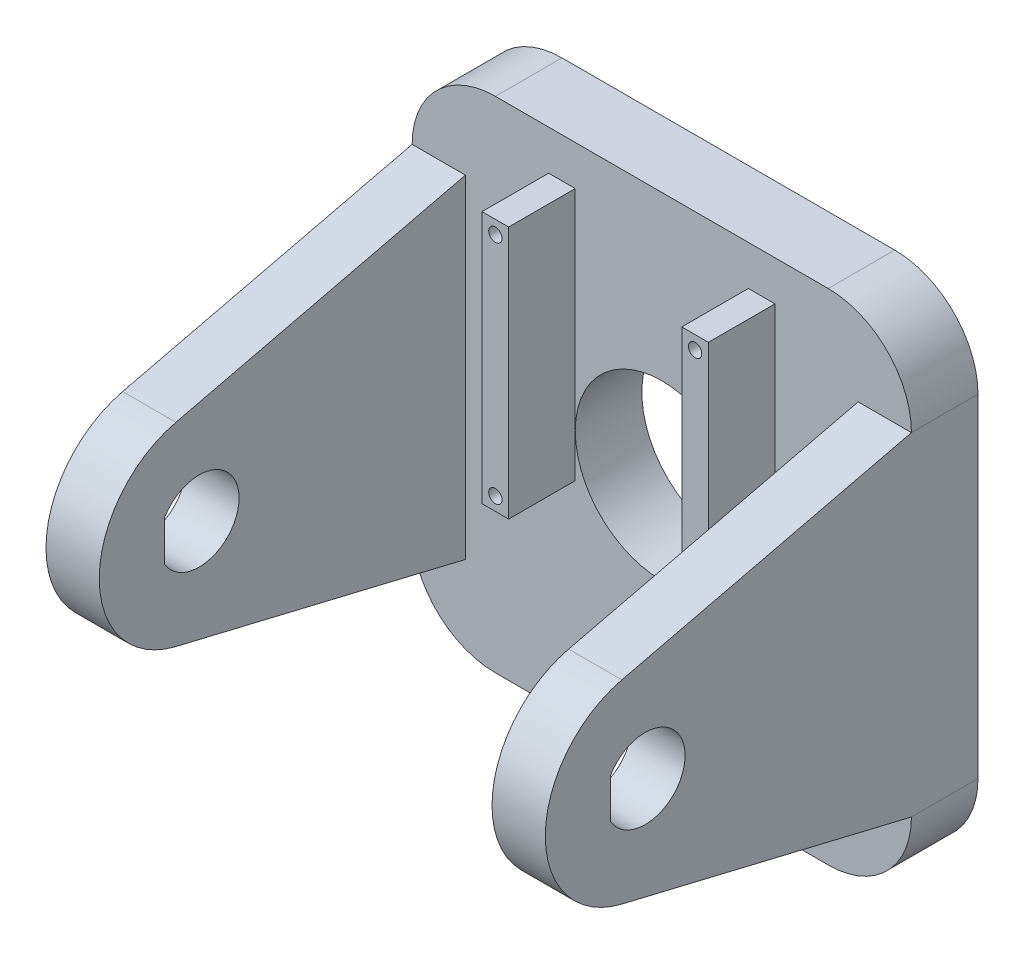
ISO-10303-21;
HEADER;
FILE_DESCRIPTION(('STEP AP214'),'2;1');
FILE_NAME('part.step','',(''),(''),'','','');
FILE_SCHEMA(('AUTOMOTIVE_DESIGN { 1 0 10303 214 1 1 1 1 }'));
ENDSEC;
DATA;
#1=APPLICATION_CONTEXT('core data for automotive mechanical design processes');
#2=APPLICATION_PROTOCOL_DEFINITION('international standard','automotive_design',2000,#1);
#3=PRODUCT_CONTEXT('',#1,'mechanical');
#4=PRODUCT('Part','Part','',(#3));
#5=PRODUCT_RELATED_PRODUCT_CATEGORY('part','',(#4));
#6=PRODUCT_DEFINITION_FORMATION('','',#4);
#7=PRODUCT_DEFINITION_CONTEXT('part definition',#1,'design');
#8=PRODUCT_DEFINITION('design','',#6,#7);
#9=PRODUCT_DEFINITION_SHAPE('','',#8);
#10=(LENGTH_UNIT() NAMED_UNIT(*) SI_UNIT(.MILLI.,.METRE.));
#11=(NAMED_UNIT(*) PLANE_ANGLE_UNIT() SI_UNIT($,.RADIAN.));
#12=(NAMED_UNIT(*) SI_UNIT($,.STERADIAN.) SOLID_ANGLE_UNIT());
#13=UNCERTAINTY_MEASURE_WITH_UNIT(LENGTH_MEASURE(1.E-05),#10,'distance_accuracy_value','');
#14=(GEOMETRIC_REPRESENTATION_CONTEXT(3) GLOBAL_UNCERTAINTY_ASSIGNED_CONTEXT((#13)) GLOBAL_UNIT_ASSIGNED_CONTEXT((#10,
#11,#12)) REPRESENTATION_CONTEXT('',''));
#15=CARTESIAN_POINT('',(0.,0.,0.));
#16=DIRECTION('',(0.,0.,1.));
#17=DIRECTION('',(1.,0.,0.));
#18=AXIS2_PLACEMENT_3D('',#15,#16,#17);
#19=CARTESIAN_POINT('',(25.,-25.,10.));
#20=DIRECTION('',(0.,0.,-1.));
#21=DIRECTION('',(-1.,0.,0.));
#22=AXIS2_PLACEMENT_3D('',#19,#20,#21);
#23=PLANE('',#22);
#24=DIRECTION('',(-1.,0.,0.));
#25=VECTOR('',#24,1.);
#26=CARTESIAN_POINT('',(-29.5,24.9999999999999,10.));
#27=LINE('',#26,#25);
#28=CARTESIAN_POINT('',(-29.5,24.9999999999999,10.));
#29=VERTEX_POINT('',#28);
#30=CARTESIAN_POINT('',(-37.5,24.9999999999999,10.));
#31=VERTEX_POINT('',#30);
#32=EDGE_CURVE('E356',#29,#31,#27,.T.);
#33=ORIENTED_EDGE('',*,*,#32,.F.);
#34=DIRECTION('',(0.,-1.,0.));
#35=VECTOR('',#34,1.);
#36=CARTESIAN_POINT('',(-29.5,0.,10.));
#37=LINE('',#36,#35);
#38=CARTESIAN_POINT('',(-29.5,-24.9999999999999,10.));
#39=VERTEX_POINT('',#38);
#40=EDGE_CURVE('E338',#29,#39,#37,.T.);
#41=ORIENTED_EDGE('',*,*,#40,.T.);
#42=DIRECTION('',(-1.,0.,0.));
#43=VECTOR('',#42,1.);
#44=CARTESIAN_POINT('',(-29.5,-24.9999999999999,10.));
#45=LINE('',#44,#43);
#46=CARTESIAN_POINT('',(-37.5,-24.9999999999999,10.));
#47=VERTEX_POINT('',#46);
#48=EDGE_CURVE('E389',#39,#47,#45,.T.);
#49=ORIENTED_EDGE('',*,*,#48,.T.);
#50=CARTESIAN_POINT('',(-25.,-25.,10.));
#51=DIRECTION('',(0.,0.,1.));
#52=DIRECTION('',(-1.,0.,0.));
#53=AXIS2_PLACEMENT_3D('',#50,#51,#52);
#54=CIRCLE('',#53,12.5);
#55=CARTESIAN_POINT('',(-24.9999999999999,-37.5,10.));
#56=VERTEX_POINT('',#55);
#57=EDGE_CURVE('E470',#47,#56,#54,.T.);
#58=ORIENTED_EDGE('',*,*,#57,.T.);
#59=DIRECTION('',(1.,0.,0.));
#60=VECTOR('',#59,1.);
#61=CARTESIAN_POINT('',(24.9999999999999,-37.5,10.));
#62=LINE('',#61,#60);
#63=CARTESIAN_POINT('',(24.9999999999999,-37.5,10.));
#64=VERTEX_POINT('',#63);
#65=EDGE_CURVE('E473',#56,#64,#62,.T.);
#66=ORIENTED_EDGE('',*,*,#65,.T.);
#67=CARTESIAN_POINT('',(25.,-25.,10.));
#68=DIRECTION('',(0.,0.,1.));
#69=DIRECTION('',(-1.,0.,0.));
#70=AXIS2_PLACEMENT_3D('',#67,#68,#69);
#71=CIRCLE('',#70,12.5);
#72=CARTESIAN_POINT('',(37.5,-24.9999999999999,10.));
#73=VERTEX_POINT('',#72);
#74=EDGE_CURVE('E456',#64,#73,#71,.T.);
#75=ORIENTED_EDGE('',*,*,#74,.T.);
#76=DIRECTION('',(1.,0.,0.));
#77=VECTOR('',#76,1.);
#78=CARTESIAN_POINT('',(29.5,-24.9999999999999,10.));
#79=LINE('',#78,#77);
#80=CARTESIAN_POINT('',(29.5,-24.9999999999999,10.));
#81=VERTEX_POINT('',#80);
#82=EDGE_CURVE('E448',#81,#73,#79,.T.);
#83=ORIENTED_EDGE('',*,*,#82,.F.);
#84=DIRECTION('',(0.,-1.,0.));
#85=VECTOR('',#84,1.);
#86=CARTESIAN_POINT('',(29.5,0.,10.));
#87=LINE('',#86,#85);
#88=CARTESIAN_POINT('',(29.5,24.9999999999999,10.));
#89=VERTEX_POINT('',#88);
#90=EDGE_CURVE('E408',#89,#81,#87,.T.);
#91=ORIENTED_EDGE('',*,*,#90,.F.);
#92=DIRECTION('',(1.,0.,0.));
#93=VECTOR('',#92,1.);
#94=CARTESIAN_POINT('',(29.5,24.9999999999999,10.));
#95=LINE('',#94,#93);
#96=CARTESIAN_POINT('',(37.5,24.9999999999999,10.));
#97=VERTEX_POINT('',#96);
#98=EDGE_CURVE('E444',#89,#97,#95,.T.);
#99=ORIENTED_EDGE('',*,*,#98,.T.);
#100=CARTESIAN_POINT('',(25.,25.,10.));
#101=DIRECTION('',(0.,0.,1.));
#102=DIRECTION('',(1.,0.,0.));
#103=AXIS2_PLACEMENT_3D('',#100,#101,#102);
#104=CIRCLE('',#103,12.5);
#105=CARTESIAN_POINT('',(24.9999999999999,37.5,10.));
#106=VERTEX_POINT('',#105);
#107=EDGE_CURVE('E460',#97,#106,#104,.T.);
#108=ORIENTED_EDGE('',*,*,#107,.T.);
#109=DIRECTION('',(-1.,0.,0.));
#110=VECTOR('',#109,1.);
#111=CARTESIAN_POINT('',(24.9999999999999,37.5,10.));
#112=LINE('',#111,#110);
#113=CARTESIAN_POINT('',(-24.9999999999999,37.5,10.));
#114=VERTEX_POINT('',#113);
#115=EDGE_CURVE('E464',#106,#114,#112,.T.);
#116=ORIENTED_EDGE('',*,*,#115,.T.);
#117=CARTESIAN_POINT('',(-25.,25.,10.));
#118=DIRECTION('',(0.,0.,1.));
#119=DIRECTION('',(-1.,0.,0.));
#120=AXIS2_PLACEMENT_3D('',#117,#118,#119);
#121=CIRCLE('',#120,12.5);
#122=EDGE_CURVE('E467',#114,#31,#121,.T.);
#123=ORIENTED_EDGE('',*,*,#122,.T.);
#124=EDGE_LOOP('',(#33,#41,#49,#58,#66,#75,#83,#91,#99,#108,#116,#123));
#125=FACE_BOUND('',#124,.T.);
#126=DIRECTION('',(1.,0.,0.));
#127=VECTOR('',#126,1.);
#128=CARTESIAN_POINT('',(0.,-6.49999999999999,10.));
#129=LINE('',#128,#127);
#130=CARTESIAN_POINT('',(-17.,-6.49999999999999,10.));
#131=VERTEX_POINT('',#130);
#132=CARTESIAN_POINT('',(-13.,-6.49999999999998,10.));
#133=VERTEX_POINT('',#132);
#134=EDGE_CURVE('E252',#131,#133,#129,.T.);
#135=ORIENTED_EDGE('',*,*,#134,.F.);
#136=DIRECTION('',(0.,-1.,0.));
#137=VECTOR('',#136,1.);
#138=CARTESIAN_POINT('',(-17.,0.,10.));
#139=LINE('',#138,#137);
#140=CARTESIAN_POINT('',(-17.,31.5,10.));
#141=VERTEX_POINT('',#140);
#142=EDGE_CURVE('E627',#141,#131,#139,.T.);
#143=ORIENTED_EDGE('',*,*,#142,.F.);
#144=DIRECTION('',(1.,0.,0.));
#145=VECTOR('',#144,1.);
#146=CARTESIAN_POINT('',(0.,31.5,10.));
#147=LINE('',#146,#145);
#148=CARTESIAN_POINT('',(-13.,31.5,10.));
#149=VERTEX_POINT('',#148);
#150=EDGE_CURVE('E70',#141,#149,#147,.T.);
#151=ORIENTED_EDGE('',*,*,#150,.T.);
#152=DIRECTION('',(0.,1.,0.));
#153=VECTOR('',#152,1.);
#154=CARTESIAN_POINT('',(-13.,0.,10.));
#155=LINE('',#154,#153);
#156=CARTESIAN_POINT('',(-13.,0.,10.));
#157=VERTEX_POINT('',#156);
#158=EDGE_CURVE('E617',#157,#149,#155,.T.);
#159=ORIENTED_EDGE('',*,*,#158,.F.);
#160=CARTESIAN_POINT('',(0.,0.,10.));
#161=DIRECTION('',(0.,0.,1.));
#162=DIRECTION('',(1.,0.,0.));
#163=AXIS2_PLACEMENT_3D('',#160,#161,#162);
#164=CIRCLE('',#163,13.);
#165=CARTESIAN_POINT('',(13.,0.,10.));
#166=VERTEX_POINT('',#165);
#167=EDGE_CURVE('E259',#166,#157,#164,.T.);
#168=ORIENTED_EDGE('',*,*,#167,.F.);
#169=DIRECTION('',(0.,1.,0.));
#170=VECTOR('',#169,1.);
#171=CARTESIAN_POINT('',(13.,0.,10.));
#172=LINE('',#171,#170);
#173=CARTESIAN_POINT('',(13.,31.5,10.));
#174=VERTEX_POINT('',#173);
#175=EDGE_CURVE('E298',#166,#174,#172,.T.);
#176=ORIENTED_EDGE('',*,*,#175,.T.);
#177=DIRECTION('',(1.,0.,0.));
#178=VECTOR('',#177,1.);
#179=CARTESIAN_POINT('',(0.,31.5,10.));
#180=LINE('',#179,#178);
#181=CARTESIAN_POINT('',(17.,31.5,10.));
#182=VERTEX_POINT('',#181);
#183=EDGE_CURVE('E270',#174,#182,#180,.T.);
#184=ORIENTED_EDGE('',*,*,#183,.T.);
#185=DIRECTION('',(0.,-1.,0.));
#186=VECTOR('',#185,1.);
#187=CARTESIAN_POINT('',(17.,0.,10.));
#188=LINE('',#187,#186);
#189=CARTESIAN_POINT('',(17.,-6.49999999999999,10.));
#190=VERTEX_POINT('',#189);
#191=EDGE_CURVE('E307',#182,#190,#188,.T.);
#192=ORIENTED_EDGE('',*,*,#191,.T.);
#193=DIRECTION('',(1.,0.,0.));
#194=VECTOR('',#193,1.);
#195=CARTESIAN_POINT('',(0.,-6.49999999999999,10.));
#196=LINE('',#195,#194);
#197=CARTESIAN_POINT('',(13.,-6.49999999999999,10.));
#198=VERTEX_POINT('',#197);
#199=EDGE_CURVE('E303',#198,#190,#196,.T.);
#200=ORIENTED_EDGE('',*,*,#199,.F.);
#201=EDGE_CURVE('E299',#198,#166,#172,.T.);
#202=ORIENTED_EDGE('',*,*,#201,.T.);
#203=EDGE_CURVE('E254',#157,#166,#164,.T.);
#204=ORIENTED_EDGE('',*,*,#203,.F.);
#205=EDGE_CURVE('E63',#133,#157,#155,.T.);
#206=ORIENTED_EDGE('',*,*,#205,.F.);
#207=EDGE_LOOP('',(#135,#143,#151,#159,#168,#176,#184,#192,#200,#202,#204,#206));
#208=FACE_BOUND('',#207,.T.);
#209=ADVANCED_FACE('F47',(#125,#208),#23,.F.);
#210=CARTESIAN_POINT('',(25.,-25.,10.));
#211=DIRECTION('',(0.,0.,-1.));
#212=DIRECTION('',(-1.,0.,0.));
#213=AXIS2_PLACEMENT_3D('',#210,#211,#212);
#214=CYLINDRICAL_SURFACE('',#213,12.5);
#215=CARTESIAN_POINT('',(25.,-25.,0.));
#216=DIRECTION('',(0.,0.,1.));
#217=DIRECTION('',(-1.,0.,0.));
#218=AXIS2_PLACEMENT_3D('',#215,#216,#217);
#219=CIRCLE('',#218,12.5);
#220=CARTESIAN_POINT('',(24.9999999999999,-37.5,0.));
#221=VERTEX_POINT('',#220);
#222=CARTESIAN_POINT('',(37.5,-24.9999999999999,0.));
#223=VERTEX_POINT('',#222);
#224=EDGE_CURVE('E440',#221,#223,#219,.T.);
#225=ORIENTED_EDGE('',*,*,#224,.T.);
#226=DIRECTION('',(0.,0.,-1.));
#227=VECTOR('',#226,1.);
#228=CARTESIAN_POINT('',(37.5,-24.9999999999999,10.));
#229=LINE('',#228,#227);
#230=EDGE_CURVE('E11',#73,#223,#229,.T.);
#231=ORIENTED_EDGE('',*,*,#230,.F.);
#232=ORIENTED_EDGE('',*,*,#74,.F.);
#233=DIRECTION('',(0.,0.,-1.));
#234=VECTOR('',#233,1.);
#235=CARTESIAN_POINT('',(24.9999999999999,-37.5,10.));
#236=LINE('',#235,#234);
#237=EDGE_CURVE('E476',#64,#221,#236,.T.);
#238=ORIENTED_EDGE('',*,*,#237,.T.);
#239=EDGE_LOOP('',(#225,#231,#232,#238));
#240=FACE_BOUND('',#239,.T.);
#241=ADVANCED_FACE('F49',(#240),#214,.T.);
#242=CARTESIAN_POINT('',(37.5,-24.9999999999999,10.));
#243=DIRECTION('',(-1.,0.,0.));
#244=DIRECTION('',(0.,0.,1.));
#245=AXIS2_PLACEMENT_3D('',#242,#243,#244);
#246=PLANE('',#245);
#247=DIRECTION('',(0.,1.,0.));
#248=VECTOR('',#247,1.);
#249=CARTESIAN_POINT('',(37.5,-24.9999999999999,0.));
#250=LINE('',#249,#248);
#251=CARTESIAN_POINT('',(37.5,24.9999999999999,0.));
#252=VERTEX_POINT('',#251);
#253=EDGE_CURVE('E480',#223,#252,#250,.T.);
#254=ORIENTED_EDGE('',*,*,#253,.T.);
#255=DIRECTION('',(0.,0.,-1.));
#256=VECTOR('',#255,1.);
#257=CARTESIAN_POINT('',(37.5,24.9999999999999,10.));
#258=LINE('',#257,#256);
#259=EDGE_CURVE('E56',#97,#252,#258,.T.);
#260=ORIENTED_EDGE('',*,*,#259,.F.);
#261=DIRECTION('',(0.,-0.232824264606692,0.972518823370711));
#262=VECTOR('',#261,1.);
#263=CARTESIAN_POINT('',(37.5,25.9090813439333,6.20272087858274));
#264=LINE('',#263,#262);
#265=CARTESIAN_POINT('',(37.5,14.5877823505607,53.4923639691004));
#266=VERTEX_POINT('',#265);
#267=EDGE_CURVE('E378',#97,#266,#264,.T.);
#268=ORIENTED_EDGE('',*,*,#267,.T.);
#269=CARTESIAN_POINT('',(37.5,0.,50.));
#270=DIRECTION('',(1.,0.,0.));
#271=DIRECTION('',(0.,0.,-1.));
#272=AXIS2_PLACEMENT_3D('',#269,#270,#271);
#273=CIRCLE('',#272,15.);
#274=CARTESIAN_POINT('',(37.5,-14.5877823505607,53.4923639691004));
#275=VERTEX_POINT('',#274);
#276=EDGE_CURVE('E422',#266,#275,#273,.T.);
#277=ORIENTED_EDGE('',*,*,#276,.T.);
#278=DIRECTION('',(0.,0.232824264606693,0.972518823370711));
#279=VECTOR('',#278,1.);
#280=CARTESIAN_POINT('',(37.5,-25.9090813439333,6.20272087858275));
#281=LINE('',#280,#279);
#282=EDGE_CURVE('E426',#73,#275,#281,.T.);
#283=ORIENTED_EDGE('',*,*,#282,.F.);
#284=ORIENTED_EDGE('',*,*,#230,.T.);
#285=EDGE_LOOP('',(#254,#260,#268,#277,#283,#284));
#286=FACE_BOUND('',#285,.T.);
#287=CARTESIAN_POINT('',(37.5,0.,50.));
#288=DIRECTION('',(1.,0.,0.));
#289=DIRECTION('',(0.,0.,-1.));
#290=AXIS2_PLACEMENT_3D('',#287,#288,#289);
#291=CIRCLE('',#290,6.);
#292=CARTESIAN_POINT('',(37.5,-3.,55.1961524227066));
#293=VERTEX_POINT('',#292);
#294=CARTESIAN_POINT('',(37.5,3.,55.1961524227066));
#295=VERTEX_POINT('',#294);
#296=EDGE_CURVE('E430',#293,#295,#291,.T.);
#297=ORIENTED_EDGE('',*,*,#296,.F.);
#298=DIRECTION('',(0.,1.,0.));
#299=VECTOR('',#298,1.);
#300=CARTESIAN_POINT('',(37.5,0.,55.1961524227066));
#301=LINE('',#300,#299);
#302=EDGE_CURVE('E401',#293,#295,#301,.T.);
#303=ORIENTED_EDGE('',*,*,#302,.T.);
#304=EDGE_LOOP('',(#297,#303));
#305=FACE_BOUND('',#304,.T.);
#306=ADVANCED_FACE('F562',(#286,#305),#246,.F.);
#307=CARTESIAN_POINT('',(25.,25.,10.));
#308=DIRECTION('',(0.,0.,-1.));
#309=DIRECTION('',(-1.,0.,0.));
#310=AXIS2_PLACEMENT_3D('',#307,#308,#309);
#311=CYLINDRICAL_SURFACE('',#310,12.5);
#312=CARTESIAN_POINT('',(25.,25.,0.));
#313=DIRECTION('',(0.,0.,1.));
#314=DIRECTION('',(1.,0.,0.));
#315=AXIS2_PLACEMENT_3D('',#312,#313,#314);
#316=CIRCLE('',#315,12.5);
#317=CARTESIAN_POINT('',(24.9999999999999,37.5,0.));
#318=VERTEX_POINT('',#317);
#319=EDGE_CURVE('E483',#252,#318,#316,.T.);
#320=ORIENTED_EDGE('',*,*,#319,.T.);
#321=DIRECTION('',(0.,0.,-1.));
#322=VECTOR('',#321,1.);
#323=CARTESIAN_POINT('',(24.9999999999999,37.5,10.));
#324=LINE('',#323,#322);
#325=EDGE_CURVE('E519',#106,#318,#324,.T.);
#326=ORIENTED_EDGE('',*,*,#325,.F.);
#327=ORIENTED_EDGE('',*,*,#107,.F.);
#328=ORIENTED_EDGE('',*,*,#259,.T.);
#329=EDGE_LOOP('',(#320,#326,#327,#328));
#330=FACE_BOUND('',#329,.T.);
#331=ADVANCED_FACE('F528',(#330),#311,.T.);
#332=CARTESIAN_POINT('',(24.9999999999999,37.5,10.));
#333=DIRECTION('',(0.,-1.,0.));
#334=DIRECTION('',(0.,0.,-1.));
#335=AXIS2_PLACEMENT_3D('',#332,#333,#334);
#336=PLANE('',#335);
#337=DIRECTION('',(-1.,0.,0.));
#338=VECTOR('',#337,1.);
#339=CARTESIAN_POINT('',(24.9999999999999,37.5,0.));
#340=LINE('',#339,#338);
#341=CARTESIAN_POINT('',(-24.9999999999999,37.5,0.));
#342=VERTEX_POINT('',#341);
#343=EDGE_CURVE('E486',#318,#342,#340,.T.);
#344=ORIENTED_EDGE('',*,*,#343,.T.);
#345=DIRECTION('',(0.,0.,-1.));
#346=VECTOR('',#345,1.);
#347=CARTESIAN_POINT('',(-24.9999999999999,37.5,10.));
#348=LINE('',#347,#346);
#349=EDGE_CURVE('E515',#114,#342,#348,.T.);
#350=ORIENTED_EDGE('',*,*,#349,.F.);
#351=ORIENTED_EDGE('',*,*,#115,.F.);
#352=ORIENTED_EDGE('',*,*,#325,.T.);
#353=EDGE_LOOP('',(#344,#350,#351,#352));
#354=FACE_BOUND('',#353,.T.);
#355=ADVANCED_FACE('F539',(#354),#336,.F.);
#356=CARTESIAN_POINT('',(-25.,25.,10.));
#357=DIRECTION('',(0.,0.,-1.));
#358=DIRECTION('',(-1.,0.,0.));
#359=AXIS2_PLACEMENT_3D('',#356,#357,#358);
#360=CYLINDRICAL_SURFACE('',#359,12.5);
#361=CARTESIAN_POINT('',(-25.,25.,0.));
#362=DIRECTION('',(0.,0.,1.));
#363=DIRECTION('',(-1.,0.,0.));
#364=AXIS2_PLACEMENT_3D('',#361,#362,#363);
#365=CIRCLE('',#364,12.5);
#366=CARTESIAN_POINT('',(-37.5,24.9999999999999,0.));
#367=VERTEX_POINT('',#366);
#368=EDGE_CURVE('E489',#342,#367,#365,.T.);
#369=ORIENTED_EDGE('',*,*,#368,.T.);
#370=DIRECTION('',(0.,0.,-1.));
#371=VECTOR('',#370,1.);
#372=CARTESIAN_POINT('',(-37.5,24.9999999999999,10.));
#373=LINE('',#372,#371);
#374=EDGE_CURVE('E511',#31,#367,#373,.T.);
#375=ORIENTED_EDGE('',*,*,#374,.F.);
#376=ORIENTED_EDGE('',*,*,#122,.F.);
#377=ORIENTED_EDGE('',*,*,#349,.T.);
#378=EDGE_LOOP('',(#369,#375,#376,#377));
#379=FACE_BOUND('',#378,.T.);
#380=ADVANCED_FACE('F543',(#379),#360,.T.);
#381=CARTESIAN_POINT('',(-37.5,-24.9999999999999,10.));
#382=DIRECTION('',(1.,0.,0.));
#383=DIRECTION('',(0.,0.,-1.));
#384=AXIS2_PLACEMENT_3D('',#381,#382,#383);
#385=PLANE('',#384);
#386=DIRECTION('',(0.,-1.,0.));
#387=VECTOR('',#386,1.);
#388=CARTESIAN_POINT('',(-37.5,-24.9999999999999,0.));
#389=LINE('',#388,#387);
#390=CARTESIAN_POINT('',(-37.5,-24.9999999999999,0.));
#391=VERTEX_POINT('',#390);
#392=EDGE_CURVE('E492',#367,#391,#389,.T.);
#393=ORIENTED_EDGE('',*,*,#392,.T.);
#394=DIRECTION('',(0.,0.,-1.));
#395=VECTOR('',#394,1.);
#396=CARTESIAN_POINT('',(-37.5,-24.9999999999999,10.));
#397=LINE('',#396,#395);
#398=EDGE_CURVE('E507',#47,#391,#397,.T.);
#399=ORIENTED_EDGE('',*,*,#398,.F.);
#400=DIRECTION('',(0.,0.232824264606693,0.972518823370711));
#401=VECTOR('',#400,1.);
#402=CARTESIAN_POINT('',(-37.5,-25.9090813439333,6.20272087858275));
#403=LINE('',#402,#401);
#404=CARTESIAN_POINT('',(-37.5,-14.5877823505607,53.4923639691004));
#405=VERTEX_POINT('',#404);
#406=EDGE_CURVE('E360',#47,#405,#403,.T.);
#407=ORIENTED_EDGE('',*,*,#406,.T.);
#408=CARTESIAN_POINT('',(-37.5,0.,50.));
#409=DIRECTION('',(1.,0.,0.));
#410=DIRECTION('',(0.,0.,-1.));
#411=AXIS2_PLACEMENT_3D('',#408,#409,#410);
#412=CIRCLE('',#411,15.);
#413=CARTESIAN_POINT('',(-37.5,14.5877823505607,53.4923639691004));
#414=VERTEX_POINT('',#413);
#415=EDGE_CURVE('E364',#414,#405,#412,.T.);
#416=ORIENTED_EDGE('',*,*,#415,.F.);
#417=DIRECTION('',(0.,-0.232824264606692,0.972518823370711));
#418=VECTOR('',#417,1.);
#419=CARTESIAN_POINT('',(-37.5,25.9090813439333,6.20272087858274));
#420=LINE('',#419,#418);
#421=EDGE_CURVE('E330',#31,#414,#420,.T.);
#422=ORIENTED_EDGE('',*,*,#421,.F.);
#423=ORIENTED_EDGE('',*,*,#374,.T.);
#424=EDGE_LOOP('',(#393,#399,#407,#416,#422,#423));
#425=FACE_BOUND('',#424,.T.);
#426=CARTESIAN_POINT('',(-37.5,0.,50.));
#427=DIRECTION('',(1.,0.,0.));
#428=DIRECTION('',(0.,0.,-1.));
#429=AXIS2_PLACEMENT_3D('',#426,#427,#428);
#430=CIRCLE('',#429,6.);
#431=CARTESIAN_POINT('',(-37.5,-3.,55.1961524227066));
#432=VERTEX_POINT('',#431);
#433=CARTESIAN_POINT('',(-37.5,3.,55.1961524227066));
#434=VERTEX_POINT('',#433);
#435=EDGE_CURVE('E368',#432,#434,#430,.T.);
#436=ORIENTED_EDGE('',*,*,#435,.T.);
#437=DIRECTION('',(0.,1.,0.));
#438=VECTOR('',#437,1.);
#439=CARTESIAN_POINT('',(-37.5,0.,55.1961524227066));
#440=LINE('',#439,#438);
#441=EDGE_CURVE('E339',#432,#434,#440,.T.);
#442=ORIENTED_EDGE('',*,*,#441,.F.);
#443=EDGE_LOOP('',(#436,#442));
#444=FACE_BOUND('',#443,.T.);
#445=ADVANCED_FACE('F724',(#425,#444),#385,.F.);
#446=CARTESIAN_POINT('',(-25.,-25.,10.));
#447=DIRECTION('',(0.,0.,-1.));
#448=DIRECTION('',(-1.,0.,0.));
#449=AXIS2_PLACEMENT_3D('',#446,#447,#448);
#450=CYLINDRICAL_SURFACE('',#449,12.5);
#451=CARTESIAN_POINT('',(-25.,-25.,0.));
#452=DIRECTION('',(0.,0.,1.));
#453=DIRECTION('',(-1.,0.,0.));
#454=AXIS2_PLACEMENT_3D('',#451,#452,#453);
#455=CIRCLE('',#454,12.5);
#456=CARTESIAN_POINT('',(-24.9999999999999,-37.5,0.));
#457=VERTEX_POINT('',#456);
#458=EDGE_CURVE('E495',#391,#457,#455,.T.);
#459=ORIENTED_EDGE('',*,*,#458,.T.);
#460=DIRECTION('',(0.,0.,-1.));
#461=VECTOR('',#460,1.);
#462=CARTESIAN_POINT('',(-24.9999999999999,-37.5,10.));
#463=LINE('',#462,#461);
#464=EDGE_CURVE('E503',#56,#457,#463,.T.);
#465=ORIENTED_EDGE('',*,*,#464,.F.);
#466=ORIENTED_EDGE('',*,*,#57,.F.);
#467=ORIENTED_EDGE('',*,*,#398,.T.);
#468=EDGE_LOOP('',(#459,#465,#466,#467));
#469=FACE_BOUND('',#468,.T.);
#470=ADVANCED_FACE('F737',(#469),#450,.T.);
#471=CARTESIAN_POINT('',(24.9999999999999,-37.5,10.));
#472=DIRECTION('',(0.,1.,0.));
#473=DIRECTION('',(0.,0.,1.));
#474=AXIS2_PLACEMENT_3D('',#471,#472,#473);
#475=PLANE('',#474);
#476=DIRECTION('',(1.,0.,0.));
#477=VECTOR('',#476,1.);
#478=CARTESIAN_POINT('',(24.9999999999999,-37.5,0.));
#479=LINE('',#478,#477);
#480=EDGE_CURVE('E461',#457,#221,#479,.T.);
#481=ORIENTED_EDGE('',*,*,#480,.T.);
#482=ORIENTED_EDGE('',*,*,#237,.F.);
#483=ORIENTED_EDGE('',*,*,#65,.F.);
#484=ORIENTED_EDGE('',*,*,#464,.T.);
#485=EDGE_LOOP('',(#481,#482,#483,#484));
#486=FACE_BOUND('',#485,.T.);
#487=ADVANCED_FACE('F741',(#486),#475,.F.);
#488=CARTESIAN_POINT('',(25.,-25.,0.));
#489=DIRECTION('',(0.,0.,-1.));
#490=DIRECTION('',(-1.,0.,0.));
#491=AXIS2_PLACEMENT_3D('',#488,#489,#490);
#492=PLANE('',#491);
#493=CARTESIAN_POINT('',(0.,0.,0.));
#494=DIRECTION('',(0.,0.,1.));
#495=DIRECTION('',(1.,0.,0.));
#496=AXIS2_PLACEMENT_3D('',#493,#494,#495);
#497=CIRCLE('',#496,13.);
#498=CARTESIAN_POINT('',(13.,0.,0.));
#499=VERTEX_POINT('',#498);
#500=EDGE_CURVE('E327',#499,#499,#497,.T.);
#501=ORIENTED_EDGE('',*,*,#500,.T.);
#502=EDGE_LOOP('',(#501));
#503=FACE_BOUND('',#502,.T.);
#504=ORIENTED_EDGE('',*,*,#224,.F.);
#505=ORIENTED_EDGE('',*,*,#480,.F.);
#506=ORIENTED_EDGE('',*,*,#458,.F.);
#507=ORIENTED_EDGE('',*,*,#392,.F.);
#508=ORIENTED_EDGE('',*,*,#368,.F.);
#509=ORIENTED_EDGE('',*,*,#343,.F.);
#510=ORIENTED_EDGE('',*,*,#319,.F.);
#511=ORIENTED_EDGE('',*,*,#253,.F.);
#512=EDGE_LOOP('',(#504,#505,#506,#507,#508,#509,#510,#511));
#513=FACE_BOUND('',#512,.T.);
#514=ADVANCED_FACE('F534',(#503,#513),#492,.T.);
#515=CARTESIAN_POINT('',(29.5,0.,50.));
#516=DIRECTION('',(1.,0.,0.));
#517=DIRECTION('',(0.,0.,-1.));
#518=AXIS2_PLACEMENT_3D('',#515,#516,#517);
#519=CYLINDRICAL_SURFACE('',#518,6.);
#520=ORIENTED_EDGE('',*,*,#296,.T.);
#521=DIRECTION('',(1.,0.,0.));
#522=VECTOR('',#521,1.);
#523=CARTESIAN_POINT('',(29.5,3.,55.1961524227066));
#524=LINE('',#523,#522);
#525=CARTESIAN_POINT('',(29.5,3.,55.1961524227066));
#526=VERTEX_POINT('',#525);
#527=EDGE_CURVE('E437',#526,#295,#524,.T.);
#528=ORIENTED_EDGE('',*,*,#527,.F.);
#529=CARTESIAN_POINT('',(29.5,0.,50.));
#530=DIRECTION('',(1.,0.,0.));
#531=DIRECTION('',(0.,0.,-1.));
#532=AXIS2_PLACEMENT_3D('',#529,#530,#531);
#533=CIRCLE('',#532,6.);
#534=CARTESIAN_POINT('',(29.5,-3.,55.1961524227066));
#535=VERTEX_POINT('',#534);
#536=EDGE_CURVE('E411',#535,#526,#533,.T.);
#537=ORIENTED_EDGE('',*,*,#536,.F.);
#538=DIRECTION('',(1.,0.,0.));
#539=VECTOR('',#538,1.);
#540=CARTESIAN_POINT('',(29.5,-3.,55.1961524227066));
#541=LINE('',#540,#539);
#542=EDGE_CURVE('E441',#535,#293,#541,.T.);
#543=ORIENTED_EDGE('',*,*,#542,.T.);
#544=EDGE_LOOP('',(#520,#528,#537,#543));
#545=FACE_BOUND('',#544,.T.);
#546=ADVANCED_FACE('F573',(#545),#519,.F.);
#547=CARTESIAN_POINT('',(29.5,25.9090813439333,6.20272087858274));
#548=DIRECTION('',(0.,0.972518823370711,0.232824264606692));
#549=DIRECTION('',(0.,-0.232824264606692,0.972518823370711));
#550=AXIS2_PLACEMENT_3D('',#547,#548,#549);
#551=PLANE('',#550);
#552=ORIENTED_EDGE('',*,*,#267,.F.);
#553=ORIENTED_EDGE('',*,*,#98,.F.);
#554=DIRECTION('',(0.,-0.232824264606692,0.972518823370711));
#555=VECTOR('',#554,1.);
#556=CARTESIAN_POINT('',(29.5,25.9090813439333,6.20272087858274));
#557=LINE('',#556,#555);
#558=CARTESIAN_POINT('',(29.5,14.5877823505607,53.4923639691004));
#559=VERTEX_POINT('',#558);
#560=EDGE_CURVE('E396',#89,#559,#557,.T.);
#561=ORIENTED_EDGE('',*,*,#560,.T.);
#562=DIRECTION('',(1.,0.,0.));
#563=VECTOR('',#562,1.);
#564=CARTESIAN_POINT('',(29.5,14.5877823505607,53.4923639691004));
#565=LINE('',#564,#563);
#566=EDGE_CURVE('E418',#559,#266,#565,.T.);
#567=ORIENTED_EDGE('',*,*,#566,.T.);
#568=EDGE_LOOP('',(#552,#553,#561,#567));
#569=FACE_BOUND('',#568,.T.);
#570=ADVANCED_FACE('F551',(#569),#551,.T.);
#571=CARTESIAN_POINT('',(29.5,-25.9090813439333,6.20272087858275));
#572=DIRECTION('',(0.,0.972518823370711,-0.232824264606693));
#573=DIRECTION('',(0.,0.232824264606692,0.972518823370711));
#574=AXIS2_PLACEMENT_3D('',#571,#572,#573);
#575=PLANE('',#574);
#576=ORIENTED_EDGE('',*,*,#282,.T.);
#577=DIRECTION('',(1.,0.,0.));
#578=VECTOR('',#577,1.);
#579=CARTESIAN_POINT('',(29.5,-14.5877823505607,53.4923639691004));
#580=LINE('',#579,#578);
#581=CARTESIAN_POINT('',(29.5,-14.5877823505607,53.4923639691004));
#582=VERTEX_POINT('',#581);
#583=EDGE_CURVE('E451',#582,#275,#580,.T.);
#584=ORIENTED_EDGE('',*,*,#583,.F.);
#585=DIRECTION('',(0.,0.232824264606693,0.972518823370711));
#586=VECTOR('',#585,1.);
#587=CARTESIAN_POINT('',(29.5,-25.9090813439333,6.20272087858275));
#588=LINE('',#587,#586);
#589=EDGE_CURVE('E405',#81,#582,#588,.T.);
#590=ORIENTED_EDGE('',*,*,#589,.F.);
#591=ORIENTED_EDGE('',*,*,#82,.T.);
#592=EDGE_LOOP('',(#576,#584,#590,#591));
#593=FACE_BOUND('',#592,.T.);
#594=ADVANCED_FACE('F745',(#593),#575,.F.);
#595=CARTESIAN_POINT('',(29.5,0.,50.));
#596=DIRECTION('',(1.,0.,0.));
#597=DIRECTION('',(0.,0.,-1.));
#598=AXIS2_PLACEMENT_3D('',#595,#596,#597);
#599=CYLINDRICAL_SURFACE('',#598,15.);
#600=ORIENTED_EDGE('',*,*,#276,.F.);
#601=ORIENTED_EDGE('',*,*,#566,.F.);
#602=CARTESIAN_POINT('',(29.5,0.,50.));
#603=DIRECTION('',(1.,0.,0.));
#604=DIRECTION('',(0.,0.,-1.));
#605=AXIS2_PLACEMENT_3D('',#602,#603,#604);
#606=CIRCLE('',#605,15.);
#607=EDGE_CURVE('E400',#559,#582,#606,.T.);
#608=ORIENTED_EDGE('',*,*,#607,.T.);
#609=ORIENTED_EDGE('',*,*,#583,.T.);
#610=EDGE_LOOP('',(#600,#601,#608,#609));
#611=FACE_BOUND('',#610,.T.);
#612=ADVANCED_FACE('F560',(#611),#599,.T.);
#613=CARTESIAN_POINT('',(29.5,0.,55.1961524227066));
#614=DIRECTION('',(0.,0.,-1.));
#615=DIRECTION('',(-1.,0.,0.));
#616=AXIS2_PLACEMENT_3D('',#613,#614,#615);
#617=PLANE('',#616);
#618=ORIENTED_EDGE('',*,*,#302,.F.);
#619=ORIENTED_EDGE('',*,*,#542,.F.);
#620=DIRECTION('',(0.,1.,0.));
#621=VECTOR('',#620,1.);
#622=CARTESIAN_POINT('',(29.5,0.,55.1961524227066));
#623=LINE('',#622,#621);
#624=EDGE_CURVE('E414',#535,#526,#623,.T.);
#625=ORIENTED_EDGE('',*,*,#624,.T.);
#626=ORIENTED_EDGE('',*,*,#527,.T.);
#627=EDGE_LOOP('',(#618,#619,#625,#626));
#628=FACE_BOUND('',#627,.T.);
#629=ADVANCED_FACE('F570',(#628),#617,.T.);
#630=CARTESIAN_POINT('',(29.5,0.,0.));
#631=DIRECTION('',(1.,0.,0.));
#632=DIRECTION('',(0.,0.,-1.));
#633=AXIS2_PLACEMENT_3D('',#630,#631,#632);
#634=PLANE('',#633);
#635=ORIENTED_EDGE('',*,*,#560,.F.);
#636=ORIENTED_EDGE('',*,*,#90,.T.);
#637=ORIENTED_EDGE('',*,*,#589,.T.);
#638=ORIENTED_EDGE('',*,*,#607,.F.);
#639=EDGE_LOOP('',(#635,#636,#637,#638));
#640=FACE_BOUND('',#639,.T.);
#641=ORIENTED_EDGE('',*,*,#536,.T.);
#642=ORIENTED_EDGE('',*,*,#624,.F.);
#643=EDGE_LOOP('',(#641,#642));
#644=FACE_BOUND('',#643,.T.);
#645=ADVANCED_FACE('F554',(#640,#644),#634,.F.);
#646=CARTESIAN_POINT('',(-29.5,0.,50.));
#647=DIRECTION('',(-1.,0.,0.));
#648=DIRECTION('',(0.,0.,1.));
#649=AXIS2_PLACEMENT_3D('',#646,#647,#648);
#650=CYLINDRICAL_SURFACE('',#649,6.);
#651=ORIENTED_EDGE('',*,*,#435,.F.);
#652=DIRECTION('',(-1.,0.,0.));
#653=VECTOR('',#652,1.);
#654=CARTESIAN_POINT('',(-29.5,-3.,55.1961524227066));
#655=LINE('',#654,#653);
#656=CARTESIAN_POINT('',(-29.5,-3.,55.1961524227066));
#657=VERTEX_POINT('',#656);
#658=EDGE_CURVE('E375',#657,#432,#655,.T.);
#659=ORIENTED_EDGE('',*,*,#658,.F.);
#660=CARTESIAN_POINT('',(-29.5,0.,50.));
#661=DIRECTION('',(1.,0.,0.));
#662=DIRECTION('',(0.,0.,-1.));
#663=AXIS2_PLACEMENT_3D('',#660,#661,#662);
#664=CIRCLE('',#663,6.);
#665=CARTESIAN_POINT('',(-29.5,3.,55.1961524227066));
#666=VERTEX_POINT('',#665);
#667=EDGE_CURVE('E349',#657,#666,#664,.T.);
#668=ORIENTED_EDGE('',*,*,#667,.T.);
#669=DIRECTION('',(-1.,0.,0.));
#670=VECTOR('',#669,1.);
#671=CARTESIAN_POINT('',(-29.5,3.,55.1961524227066));
#672=LINE('',#671,#670);
#673=EDGE_CURVE('E379',#666,#434,#672,.T.);
#674=ORIENTED_EDGE('',*,*,#673,.T.);
#675=EDGE_LOOP('',(#651,#659,#668,#674));
#676=FACE_BOUND('',#675,.T.);
#677=ADVANCED_FACE('F575',(#676),#650,.F.);
#678=CARTESIAN_POINT('',(-29.5,25.9090813439333,6.20272087858274));
#679=DIRECTION('',(0.,-0.972518823370711,-0.232824264606692));
#680=DIRECTION('',(0.,0.232824264606692,-0.972518823370711));
#681=AXIS2_PLACEMENT_3D('',#678,#679,#680);
#682=PLANE('',#681);
#683=ORIENTED_EDGE('',*,*,#421,.T.);
#684=DIRECTION('',(-1.,0.,0.));
#685=VECTOR('',#684,1.);
#686=CARTESIAN_POINT('',(-29.5,14.5877823505607,53.4923639691004));
#687=LINE('',#686,#685);
#688=CARTESIAN_POINT('',(-29.5,14.5877823505607,53.4923639691004));
#689=VERTEX_POINT('',#688);
#690=EDGE_CURVE('E382',#689,#414,#687,.T.);
#691=ORIENTED_EDGE('',*,*,#690,.F.);
#692=DIRECTION('',(0.,-0.232824264606692,0.972518823370711));
#693=VECTOR('',#692,1.);
#694=CARTESIAN_POINT('',(-29.5,25.9090813439333,6.20272087858274));
#695=LINE('',#694,#693);
#696=EDGE_CURVE('E334',#29,#689,#695,.T.);
#697=ORIENTED_EDGE('',*,*,#696,.F.);
#698=ORIENTED_EDGE('',*,*,#32,.T.);
#699=EDGE_LOOP('',(#683,#691,#697,#698));
#700=FACE_BOUND('',#699,.T.);
#701=ADVANCED_FACE('F582',(#700),#682,.F.);
#702=CARTESIAN_POINT('',(-29.5,0.,50.));
#703=DIRECTION('',(-1.,0.,0.));
#704=DIRECTION('',(0.,0.,1.));
#705=AXIS2_PLACEMENT_3D('',#702,#703,#704);
#706=CYLINDRICAL_SURFACE('',#705,15.);
#707=ORIENTED_EDGE('',*,*,#415,.T.);
#708=DIRECTION('',(-1.,0.,0.));
#709=VECTOR('',#708,1.);
#710=CARTESIAN_POINT('',(-29.5,-14.5877823505607,53.4923639691004));
#711=LINE('',#710,#709);
#712=CARTESIAN_POINT('',(-29.5,-14.5877823505607,53.4923639691004));
#713=VERTEX_POINT('',#712);
#714=EDGE_CURVE('E386',#713,#405,#711,.T.);
#715=ORIENTED_EDGE('',*,*,#714,.F.);
#716=CARTESIAN_POINT('',(-29.5,0.,50.));
#717=DIRECTION('',(1.,0.,0.));
#718=DIRECTION('',(0.,0.,-1.));
#719=AXIS2_PLACEMENT_3D('',#716,#717,#718);
#720=CIRCLE('',#719,15.);
#721=EDGE_CURVE('E346',#689,#713,#720,.T.);
#722=ORIENTED_EDGE('',*,*,#721,.F.);
#723=ORIENTED_EDGE('',*,*,#690,.T.);
#724=EDGE_LOOP('',(#707,#715,#722,#723));
#725=FACE_BOUND('',#724,.T.);
#726=ADVANCED_FACE('F711',(#725),#706,.T.);
#727=CARTESIAN_POINT('',(-29.5,-25.9090813439333,6.20272087858275));
#728=DIRECTION('',(0.,-0.972518823370711,0.232824264606693));
#729=DIRECTION('',(0.,-0.232824264606692,-0.972518823370711));
#730=AXIS2_PLACEMENT_3D('',#727,#728,#729);
#731=PLANE('',#730);
#732=ORIENTED_EDGE('',*,*,#406,.F.);
#733=ORIENTED_EDGE('',*,*,#48,.F.);
#734=DIRECTION('',(0.,0.232824264606693,0.972518823370711));
#735=VECTOR('',#734,1.);
#736=CARTESIAN_POINT('',(-29.5,-25.9090813439333,6.20272087858275));
#737=LINE('',#736,#735);
#738=EDGE_CURVE('E342',#39,#713,#737,.T.);
#739=ORIENTED_EDGE('',*,*,#738,.T.);
#740=ORIENTED_EDGE('',*,*,#714,.T.);
#741=EDGE_LOOP('',(#732,#733,#739,#740));
#742=FACE_BOUND('',#741,.T.);
#743=ADVANCED_FACE('F708',(#742),#731,.T.);
#744=CARTESIAN_POINT('',(-29.5,0.,55.1961524227066));
#745=DIRECTION('',(0.,0.,1.));
#746=DIRECTION('',(1.,0.,0.));
#747=AXIS2_PLACEMENT_3D('',#744,#745,#746);
#748=PLANE('',#747);
#749=ORIENTED_EDGE('',*,*,#441,.T.);
#750=ORIENTED_EDGE('',*,*,#673,.F.);
#751=DIRECTION('',(0.,1.,0.));
#752=VECTOR('',#751,1.);
#753=CARTESIAN_POINT('',(-29.5,0.,55.1961524227066));
#754=LINE('',#753,#752);
#755=EDGE_CURVE('E353',#657,#666,#754,.T.);
#756=ORIENTED_EDGE('',*,*,#755,.F.);
#757=ORIENTED_EDGE('',*,*,#658,.T.);
#758=EDGE_LOOP('',(#749,#750,#756,#757));
#759=FACE_BOUND('',#758,.T.);
#760=ADVANCED_FACE('F705',(#759),#748,.F.);
#761=CARTESIAN_POINT('',(-29.5,0.,0.));
#762=DIRECTION('',(-1.,0.,0.));
#763=DIRECTION('',(0.,0.,-1.));
#764=AXIS2_PLACEMENT_3D('',#761,#762,#763);
#765=PLANE('',#764);
#766=ORIENTED_EDGE('',*,*,#696,.T.);
#767=ORIENTED_EDGE('',*,*,#721,.T.);
#768=ORIENTED_EDGE('',*,*,#738,.F.);
#769=ORIENTED_EDGE('',*,*,#40,.F.);
#770=EDGE_LOOP('',(#766,#767,#768,#769));
#771=FACE_BOUND('',#770,.T.);
#772=ORIENTED_EDGE('',*,*,#667,.F.);
#773=ORIENTED_EDGE('',*,*,#755,.T.);
#774=EDGE_LOOP('',(#772,#773));
#775=FACE_BOUND('',#774,.T.);
#776=ADVANCED_FACE('F701',(#771,#775),#765,.F.);
#777=CARTESIAN_POINT('',(0.,0.,0.));
#778=DIRECTION('',(0.,0.,1.));
#779=DIRECTION('',(1.,0.,0.));
#780=AXIS2_PLACEMENT_3D('',#777,#778,#779);
#781=CYLINDRICAL_SURFACE('',#780,13.);
#782=ORIENTED_EDGE('',*,*,#500,.F.);
#783=EDGE_LOOP('',(#782));
#784=FACE_BOUND('',#783,.T.);
#785=ORIENTED_EDGE('',*,*,#167,.T.);
#786=ORIENTED_EDGE('',*,*,#203,.T.);
#787=EDGE_LOOP('',(#785,#786));
#788=FACE_BOUND('',#787,.T.);
#789=ADVANCED_FACE('F692',(#784,#788),#781,.F.);
#790=CARTESIAN_POINT('',(13.,0.,20.));
#791=DIRECTION('',(-1.,0.,0.));
#792=DIRECTION('',(0.,0.,1.));
#793=AXIS2_PLACEMENT_3D('',#790,#791,#792);
#794=PLANE('',#793);
#795=ORIENTED_EDGE('',*,*,#201,.F.);
#796=DIRECTION('',(0.,0.,-1.));
#797=VECTOR('',#796,1.);
#798=CARTESIAN_POINT('',(13.,-6.49999999999999,20.));
#799=LINE('',#798,#797);
#800=CARTESIAN_POINT('',(13.,-6.49999999999999,20.));
#801=VERTEX_POINT('',#800);
#802=EDGE_CURVE('E323',#801,#198,#799,.T.);
#803=ORIENTED_EDGE('',*,*,#802,.F.);
#804=DIRECTION('',(0.,1.,0.));
#805=VECTOR('',#804,1.);
#806=CARTESIAN_POINT('',(13.,0.,20.));
#807=LINE('',#806,#805);
#808=CARTESIAN_POINT('',(13.,31.5,20.));
#809=VERTEX_POINT('',#808);
#810=EDGE_CURVE('E274',#801,#809,#807,.T.);
#811=ORIENTED_EDGE('',*,*,#810,.T.);
#812=DIRECTION('',(0.,0.,-1.));
#813=VECTOR('',#812,1.);
#814=CARTESIAN_POINT('',(13.,31.5,20.));
#815=LINE('',#814,#813);
#816=EDGE_CURVE('E289',#809,#174,#815,.T.);
#817=ORIENTED_EDGE('',*,*,#816,.T.);
#818=ORIENTED_EDGE('',*,*,#175,.F.);
#819=EDGE_LOOP('',(#795,#803,#811,#817,#818));
#820=FACE_BOUND('',#819,.T.);
#821=ADVANCED_FACE('F688',(#820),#794,.T.);
#822=CARTESIAN_POINT('',(0.,-6.49999999999999,20.));
#823=DIRECTION('',(0.,1.,0.));
#824=DIRECTION('',(0.,0.,1.));
#825=AXIS2_PLACEMENT_3D('',#822,#823,#824);
#826=PLANE('',#825);
#827=ORIENTED_EDGE('',*,*,#199,.T.);
#828=DIRECTION('',(0.,0.,-1.));
#829=VECTOR('',#828,1.);
#830=CARTESIAN_POINT('',(17.,-6.49999999999999,20.));
#831=LINE('',#830,#829);
#832=CARTESIAN_POINT('',(17.,-6.49999999999999,20.));
#833=VERTEX_POINT('',#832);
#834=EDGE_CURVE('E320',#833,#190,#831,.T.);
#835=ORIENTED_EDGE('',*,*,#834,.F.);
#836=DIRECTION('',(1.,0.,0.));
#837=VECTOR('',#836,1.);
#838=CARTESIAN_POINT('',(0.,-6.49999999999999,20.));
#839=LINE('',#838,#837);
#840=EDGE_CURVE('E278',#801,#833,#839,.T.);
#841=ORIENTED_EDGE('',*,*,#840,.F.);
#842=ORIENTED_EDGE('',*,*,#802,.T.);
#843=EDGE_LOOP('',(#827,#835,#841,#842));
#844=FACE_BOUND('',#843,.T.);
#845=ADVANCED_FACE('F684',(#844),#826,.F.);
#846=CARTESIAN_POINT('',(17.,0.,20.));
#847=DIRECTION('',(1.,0.,0.));
#848=DIRECTION('',(0.,0.,-1.));
#849=AXIS2_PLACEMENT_3D('',#846,#847,#848);
#850=PLANE('',#849);
#851=ORIENTED_EDGE('',*,*,#191,.F.);
#852=DIRECTION('',(0.,0.,-1.));
#853=VECTOR('',#852,1.);
#854=CARTESIAN_POINT('',(17.,31.5,20.));
#855=LINE('',#854,#853);
#856=CARTESIAN_POINT('',(17.,31.5,20.));
#857=VERTEX_POINT('',#856);
#858=EDGE_CURVE('E316',#857,#182,#855,.T.);
#859=ORIENTED_EDGE('',*,*,#858,.F.);
#860=DIRECTION('',(0.,-1.,0.));
#861=VECTOR('',#860,1.);
#862=CARTESIAN_POINT('',(17.,0.,20.));
#863=LINE('',#862,#861);
#864=EDGE_CURVE('E281',#857,#833,#863,.T.);
#865=ORIENTED_EDGE('',*,*,#864,.T.);
#866=ORIENTED_EDGE('',*,*,#834,.T.);
#867=EDGE_LOOP('',(#851,#859,#865,#866));
#868=FACE_BOUND('',#867,.T.);
#869=ADVANCED_FACE('F680',(#868),#850,.T.);
#870=CARTESIAN_POINT('',(15.,-4.49999999999999,20.));
#871=DIRECTION('',(0.,0.,-1.));
#872=DIRECTION('',(-1.,0.,0.));
#873=AXIS2_PLACEMENT_3D('',#870,#871,#872);
#874=CYLINDRICAL_SURFACE('',#873,0.999999999999601);
#875=CARTESIAN_POINT('',(15.,-4.49999999999999,20.));
#876=DIRECTION('',(0.,0.,1.));
#877=DIRECTION('',(1.,0.,0.));
#878=AXIS2_PLACEMENT_3D('',#875,#876,#877);
#879=CIRCLE('',#878,0.999999999999601);
#880=CARTESIAN_POINT('',(15.9999999999996,-4.49999999999999,20.));
#881=VERTEX_POINT('',#880);
#882=EDGE_CURVE('E269',#881,#881,#879,.T.);
#883=ORIENTED_EDGE('',*,*,#882,.T.);
#884=EDGE_LOOP('',(#883));
#885=FACE_BOUND('',#884,.T.);
#886=CARTESIAN_POINT('',(15.,-4.49999999999999,10.));
#887=DIRECTION('',(0.,0.,1.));
#888=DIRECTION('',(1.,0.,0.));
#889=AXIS2_PLACEMENT_3D('',#886,#887,#888);
#890=CIRCLE('',#889,0.999999999999601);
#891=CARTESIAN_POINT('',(15.9999999999996,-4.49999999999999,10.));
#892=VERTEX_POINT('',#891);
#893=EDGE_CURVE('E294',#892,#892,#890,.T.);
#894=ORIENTED_EDGE('',*,*,#893,.F.);
#895=EDGE_LOOP('',(#894));
#896=FACE_BOUND('',#895,.T.);
#897=ADVANCED_FACE('F683',(#885,#896),#874,.F.);
#898=CARTESIAN_POINT('',(15.,29.5,20.));
#899=DIRECTION('',(0.,0.,-1.));
#900=DIRECTION('',(-1.,0.,0.));
#901=AXIS2_PLACEMENT_3D('',#898,#899,#900);
#902=CYLINDRICAL_SURFACE('',#901,0.999999999999593);
#903=CARTESIAN_POINT('',(15.,29.5,20.));
#904=DIRECTION('',(0.,0.,1.));
#905=DIRECTION('',(1.,0.,0.));
#906=AXIS2_PLACEMENT_3D('',#903,#904,#905);
#907=CIRCLE('',#906,0.999999999999593);
#908=CARTESIAN_POINT('',(15.9999999999996,29.5,20.));
#909=VERTEX_POINT('',#908);
#910=EDGE_CURVE('E265',#909,#909,#907,.T.);
#911=ORIENTED_EDGE('',*,*,#910,.T.);
#912=EDGE_LOOP('',(#911));
#913=FACE_BOUND('',#912,.T.);
#914=CARTESIAN_POINT('',(15.,29.5,10.));
#915=DIRECTION('',(0.,0.,1.));
#916=DIRECTION('',(1.,0.,0.));
#917=AXIS2_PLACEMENT_3D('',#914,#915,#916);
#918=CIRCLE('',#917,0.999999999999593);
#919=CARTESIAN_POINT('',(15.9999999999996,29.5,10.));
#920=VERTEX_POINT('',#919);
#921=EDGE_CURVE('E290',#920,#920,#918,.T.);
#922=ORIENTED_EDGE('',*,*,#921,.F.);
#923=EDGE_LOOP('',(#922));
#924=FACE_BOUND('',#923,.T.);
#925=ADVANCED_FACE('F678',(#913,#924),#902,.F.);
#926=CARTESIAN_POINT('',(0.,31.5,20.));
#927=DIRECTION('',(0.,1.,0.));
#928=DIRECTION('',(0.,0.,1.));
#929=AXIS2_PLACEMENT_3D('',#926,#927,#928);
#930=PLANE('',#929);
#931=ORIENTED_EDGE('',*,*,#183,.F.);
#932=ORIENTED_EDGE('',*,*,#816,.F.);
#933=DIRECTION('',(1.,0.,0.));
#934=VECTOR('',#933,1.);
#935=CARTESIAN_POINT('',(0.,31.5,20.));
#936=LINE('',#935,#934);
#937=EDGE_CURVE('E285',#809,#857,#936,.T.);
#938=ORIENTED_EDGE('',*,*,#937,.T.);
#939=ORIENTED_EDGE('',*,*,#858,.T.);
#940=EDGE_LOOP('',(#931,#932,#938,#939));
#941=FACE_BOUND('',#940,.T.);
#942=ADVANCED_FACE('F674',(#941),#930,.T.);
#943=CARTESIAN_POINT('',(0.,0.,20.));
#944=DIRECTION('',(0.,0.,1.));
#945=DIRECTION('',(1.,0.,0.));
#946=AXIS2_PLACEMENT_3D('',#943,#944,#945);
#947=PLANE('',#946);
#948=ORIENTED_EDGE('',*,*,#910,.F.);
#949=EDGE_LOOP('',(#948));
#950=FACE_BOUND('',#949,.T.);
#951=ORIENTED_EDGE('',*,*,#882,.F.);
#952=EDGE_LOOP('',(#951));
#953=FACE_BOUND('',#952,.T.);
#954=ORIENTED_EDGE('',*,*,#810,.F.);
#955=ORIENTED_EDGE('',*,*,#840,.T.);
#956=ORIENTED_EDGE('',*,*,#864,.F.);
#957=ORIENTED_EDGE('',*,*,#937,.F.);
#958=EDGE_LOOP('',(#954,#955,#956,#957));
#959=FACE_BOUND('',#958,.T.);
#960=ADVANCED_FACE('F671',(#950,#953,#959),#947,.T.);
#961=ORIENTED_EDGE('',*,*,#921,.T.);
#962=EDGE_LOOP('',(#961));
#963=FACE_BOUND('',#962,.T.);
#964=ADVANCED_FACE('F601',(#963),#23,.F.);
#965=ORIENTED_EDGE('',*,*,#893,.T.);
#966=EDGE_LOOP('',(#965));
#967=FACE_BOUND('',#966,.T.);
#968=ADVANCED_FACE('F589',(#967),#23,.F.);
#969=CARTESIAN_POINT('',(0.,-6.49999999999999,20.));
#970=DIRECTION('',(0.,1.,0.));
#971=DIRECTION('',(0.,0.,1.));
#972=AXIS2_PLACEMENT_3D('',#969,#970,#971);
#973=PLANE('',#972);
#974=ORIENTED_EDGE('',*,*,#134,.T.);
#975=DIRECTION('',(0.,0.,-1.));
#976=VECTOR('',#975,1.);
#977=CARTESIAN_POINT('',(-13.,-6.49999999999999,20.));
#978=LINE('',#977,#976);
#979=CARTESIAN_POINT('',(-13.,-6.49999999999999,20.));
#980=VERTEX_POINT('',#979);
#981=EDGE_CURVE('E230',#980,#133,#978,.T.);
#982=ORIENTED_EDGE('',*,*,#981,.F.);
#983=DIRECTION('',(1.,0.,0.));
#984=VECTOR('',#983,1.);
#985=CARTESIAN_POINT('',(0.,-6.49999999999999,20.));
#986=LINE('',#985,#984);
#987=CARTESIAN_POINT('',(-17.,-6.49999999999999,20.));
#988=VERTEX_POINT('',#987);
#989=EDGE_CURVE('E239',#988,#980,#986,.T.);
#990=ORIENTED_EDGE('',*,*,#989,.F.);
#991=DIRECTION('',(0.,0.,-1.));
#992=VECTOR('',#991,1.);
#993=CARTESIAN_POINT('',(-17.,-6.49999999999999,20.));
#994=LINE('',#993,#992);
#995=EDGE_CURVE('E632',#988,#131,#994,.T.);
#996=ORIENTED_EDGE('',*,*,#995,.T.);
#997=EDGE_LOOP('',(#974,#982,#990,#996));
#998=FACE_BOUND('',#997,.T.);
#999=ADVANCED_FACE('F251',(#998),#973,.F.);
#1000=CARTESIAN_POINT('',(-13.,0.,20.));
#1001=DIRECTION('',(-1.,0.,0.));
#1002=DIRECTION('',(0.,0.,1.));
#1003=AXIS2_PLACEMENT_3D('',#1000,#1001,#1002);
#1004=PLANE('',#1003);
#1005=ORIENTED_EDGE('',*,*,#205,.T.);
#1006=ORIENTED_EDGE('',*,*,#158,.T.);
#1007=DIRECTION('',(0.,0.,-1.));
#1008=VECTOR('',#1007,1.);
#1009=CARTESIAN_POINT('',(-13.,31.5,20.));
#1010=LINE('',#1009,#1008);
#1011=CARTESIAN_POINT('',(-13.,31.5,20.));
#1012=VERTEX_POINT('',#1011);
#1013=EDGE_CURVE('E233',#1012,#149,#1010,.T.);
#1014=ORIENTED_EDGE('',*,*,#1013,.F.);
#1015=DIRECTION('',(0.,1.,0.));
#1016=VECTOR('',#1015,1.);
#1017=CARTESIAN_POINT('',(-13.,0.,20.));
#1018=LINE('',#1017,#1016);
#1019=EDGE_CURVE('E226',#980,#1012,#1018,.T.);
#1020=ORIENTED_EDGE('',*,*,#1019,.F.);
#1021=ORIENTED_EDGE('',*,*,#981,.T.);
#1022=EDGE_LOOP('',(#1005,#1006,#1014,#1020,#1021));
#1023=FACE_BOUND('',#1022,.T.);
#1024=ADVANCED_FACE('F228',(#1023),#1004,.F.);
#1025=CARTESIAN_POINT('',(0.,31.5,20.));
#1026=DIRECTION('',(0.,1.,0.));
#1027=DIRECTION('',(0.,0.,1.));
#1028=AXIS2_PLACEMENT_3D('',#1025,#1026,#1027);
#1029=PLANE('',#1028);
#1030=ORIENTED_EDGE('',*,*,#150,.F.);
#1031=DIRECTION('',(0.,0.,-1.));
#1032=VECTOR('',#1031,1.);
#1033=CARTESIAN_POINT('',(-17.,31.5,20.));
#1034=LINE('',#1033,#1032);
#1035=CARTESIAN_POINT('',(-17.,31.5,20.));
#1036=VERTEX_POINT('',#1035);
#1037=EDGE_CURVE('E261',#1036,#141,#1034,.T.);
#1038=ORIENTED_EDGE('',*,*,#1037,.F.);
#1039=DIRECTION('',(1.,0.,0.));
#1040=VECTOR('',#1039,1.);
#1041=CARTESIAN_POINT('',(0.,31.5,20.));
#1042=LINE('',#1041,#1040);
#1043=EDGE_CURVE('E238',#1036,#1012,#1042,.T.);
#1044=ORIENTED_EDGE('',*,*,#1043,.T.);
#1045=ORIENTED_EDGE('',*,*,#1013,.T.);
#1046=EDGE_LOOP('',(#1030,#1038,#1044,#1045));
#1047=FACE_BOUND('',#1046,.T.);
#1048=ADVANCED_FACE('F639',(#1047),#1029,.T.);
#1049=CARTESIAN_POINT('',(-15.,-4.49999999999999,20.));
#1050=DIRECTION('',(0.,0.,-1.));
#1051=DIRECTION('',(-1.,0.,0.));
#1052=AXIS2_PLACEMENT_3D('',#1049,#1050,#1051);
#1053=CYLINDRICAL_SURFACE('',#1052,0.999999999999596);
#1054=CARTESIAN_POINT('',(-15.,-4.49999999999999,20.));
#1055=DIRECTION('',(0.,0.,1.));
#1056=DIRECTION('',(1.,0.,0.));
#1057=AXIS2_PLACEMENT_3D('',#1054,#1055,#1056);
#1058=CIRCLE('',#1057,0.999999999999596);
#1059=CARTESIAN_POINT('',(-14.0000000000004,-4.49999999999999,20.));
#1060=VERTEX_POINT('',#1059);
#1061=EDGE_CURVE('E249',#1060,#1060,#1058,.T.);
#1062=ORIENTED_EDGE('',*,*,#1061,.T.);
#1063=EDGE_LOOP('',(#1062));
#1064=FACE_BOUND('',#1063,.T.);
#1065=CARTESIAN_POINT('',(-15.,-4.49999999999999,10.));
#1066=DIRECTION('',(0.,0.,1.));
#1067=DIRECTION('',(1.,0.,0.));
#1068=AXIS2_PLACEMENT_3D('',#1065,#1066,#1067);
#1069=CIRCLE('',#1068,0.999999999999596);
#1070=CARTESIAN_POINT('',(-14.0000000000004,-4.49999999999999,10.));
#1071=VERTEX_POINT('',#1070);
#1072=EDGE_CURVE('E611',#1071,#1071,#1069,.T.);
#1073=ORIENTED_EDGE('',*,*,#1072,.F.);
#1074=EDGE_LOOP('',(#1073));
#1075=FACE_BOUND('',#1074,.T.);
#1076=ADVANCED_FACE('F659',(#1064,#1075),#1053,.F.);
#1077=CARTESIAN_POINT('',(-15.,29.5,20.));
#1078=DIRECTION('',(0.,0.,-1.));
#1079=DIRECTION('',(-1.,0.,0.));
#1080=AXIS2_PLACEMENT_3D('',#1077,#1078,#1079);
#1081=CYLINDRICAL_SURFACE('',#1080,0.999999999999586);
#1082=CARTESIAN_POINT('',(-15.,29.5,20.));
#1083=DIRECTION('',(0.,0.,1.));
#1084=DIRECTION('',(1.,0.,0.));
#1085=AXIS2_PLACEMENT_3D('',#1082,#1083,#1084);
#1086=CIRCLE('',#1085,0.999999999999586);
#1087=CARTESIAN_POINT('',(-14.0000000000004,29.5,20.));
#1088=VERTEX_POINT('',#1087);
#1089=EDGE_CURVE('E631',#1088,#1088,#1086,.T.);
#1090=ORIENTED_EDGE('',*,*,#1089,.T.);
#1091=EDGE_LOOP('',(#1090));
#1092=FACE_BOUND('',#1091,.T.);
#1093=CARTESIAN_POINT('',(-15.,29.5,10.));
#1094=DIRECTION('',(0.,0.,1.));
#1095=DIRECTION('',(1.,0.,0.));
#1096=AXIS2_PLACEMENT_3D('',#1093,#1094,#1095);
#1097=CIRCLE('',#1096,0.999999999999586);
#1098=CARTESIAN_POINT('',(-14.0000000000004,29.5,10.));
#1099=VERTEX_POINT('',#1098);
#1100=EDGE_CURVE('E326',#1099,#1099,#1097,.T.);
#1101=ORIENTED_EDGE('',*,*,#1100,.F.);
#1102=EDGE_LOOP('',(#1101));
#1103=FACE_BOUND('',#1102,.T.);
#1104=ADVANCED_FACE('F651',(#1092,#1103),#1081,.F.);
#1105=CARTESIAN_POINT('',(-17.,0.,20.));
#1106=DIRECTION('',(1.,0.,0.));
#1107=DIRECTION('',(0.,0.,-1.));
#1108=AXIS2_PLACEMENT_3D('',#1105,#1106,#1107);
#1109=PLANE('',#1108);
#1110=ORIENTED_EDGE('',*,*,#142,.T.);
#1111=ORIENTED_EDGE('',*,*,#995,.F.);
#1112=DIRECTION('',(0.,-1.,0.));
#1113=VECTOR('',#1112,1.);
#1114=CARTESIAN_POINT('',(-17.,0.,20.));
#1115=LINE('',#1114,#1113);
#1116=EDGE_CURVE('E244',#1036,#988,#1115,.T.);
#1117=ORIENTED_EDGE('',*,*,#1116,.F.);
#1118=ORIENTED_EDGE('',*,*,#1037,.T.);
#1119=EDGE_LOOP('',(#1110,#1111,#1117,#1118));
#1120=FACE_BOUND('',#1119,.T.);
#1121=ADVANCED_FACE('F637',(#1120),#1109,.F.);
#1122=CARTESIAN_POINT('',(0.,0.,20.));
#1123=DIRECTION('',(0.,0.,1.));
#1124=DIRECTION('',(1.,0.,0.));
#1125=AXIS2_PLACEMENT_3D('',#1122,#1123,#1124);
#1126=PLANE('',#1125);
#1127=ORIENTED_EDGE('',*,*,#1089,.F.);
#1128=EDGE_LOOP('',(#1127));
#1129=FACE_BOUND('',#1128,.T.);
#1130=ORIENTED_EDGE('',*,*,#1061,.F.);
#1131=EDGE_LOOP('',(#1130));
#1132=FACE_BOUND('',#1131,.T.);
#1133=ORIENTED_EDGE('',*,*,#989,.T.);
#1134=ORIENTED_EDGE('',*,*,#1019,.T.);
#1135=ORIENTED_EDGE('',*,*,#1043,.F.);
#1136=ORIENTED_EDGE('',*,*,#1116,.T.);
#1137=EDGE_LOOP('',(#1133,#1134,#1135,#1136));
#1138=FACE_BOUND('',#1137,.T.);
#1139=ADVANCED_FACE('F242',(#1129,#1132,#1138),#1126,.T.);
#1140=ORIENTED_EDGE('',*,*,#1100,.T.);
#1141=EDGE_LOOP('',(#1140));
#1142=FACE_BOUND('',#1141,.T.);
#1143=ADVANCED_FACE('F597',(#1142),#23,.F.);
#1144=ORIENTED_EDGE('',*,*,#1072,.T.);
#1145=EDGE_LOOP('',(#1144));
#1146=FACE_BOUND('',#1145,.T.);
#1147=ADVANCED_FACE('F590',(#1146),#23,.F.);
#1148=CLOSED_SHELL('',(#209,#241,#306,#331,#355,#380,#445,#470,#487,#514,#546,#570,#594,#612,
#629,#645,#677,#701,#726,#743,#760,#776,#789,#821,#845,#869,#897,#925,#942,#960,#964,#968,#999,
#1024,#1048,#1076,#1104,#1121,#1139,#1143,#1147));
#1149=MANIFOLD_SOLID_BREP('B2',#1148);
#1150=ADVANCED_BREP_SHAPE_REPRESENTATION('',(#18,#1149),#14);
#1151=SHAPE_DEFINITION_REPRESENTATION(#9,#1150);
ENDSEC;
END-ISO-10303-21;
